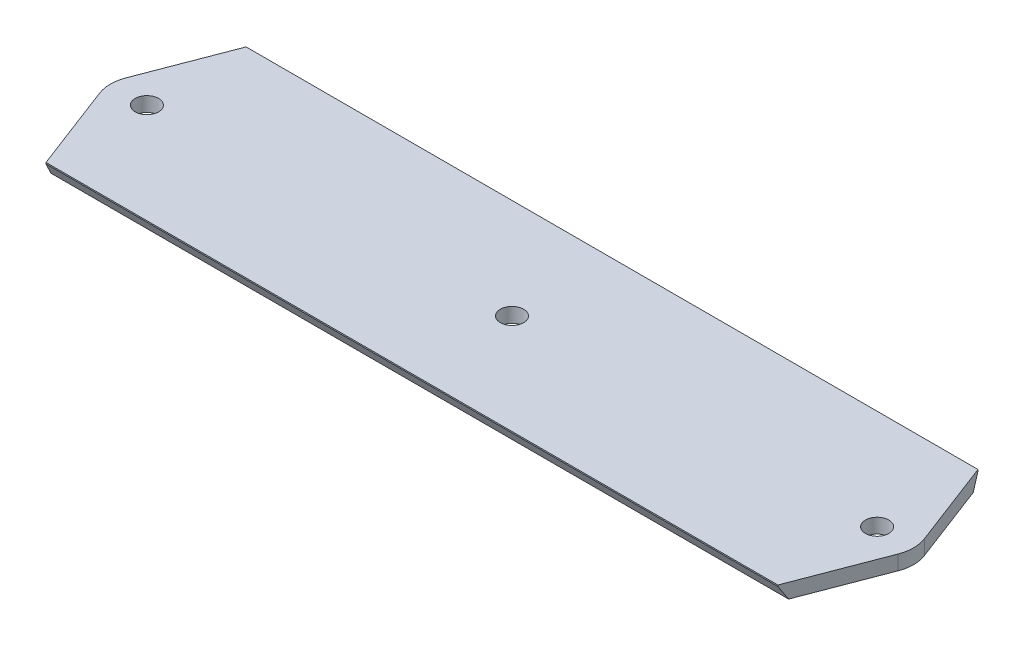
ISO-10303-21;
HEADER;
FILE_DESCRIPTION(('STEP AP214'),'2;1');
FILE_NAME('part.step','',(''),(''),'','','');
FILE_SCHEMA(('AUTOMOTIVE_DESIGN { 1 0 10303 214 1 1 1 1 }'));
ENDSEC;
DATA;
#1=APPLICATION_CONTEXT('core data for automotive mechanical design processes');
#2=APPLICATION_PROTOCOL_DEFINITION('international standard','automotive_design',2000,#1);
#3=PRODUCT_CONTEXT('',#1,'mechanical');
#4=PRODUCT('Part','Part','',(#3));
#5=PRODUCT_RELATED_PRODUCT_CATEGORY('part','',(#4));
#6=PRODUCT_DEFINITION_FORMATION('','',#4);
#7=PRODUCT_DEFINITION_CONTEXT('part definition',#1,'design');
#8=PRODUCT_DEFINITION('design','',#6,#7);
#9=PRODUCT_DEFINITION_SHAPE('','',#8);
#10=(LENGTH_UNIT() NAMED_UNIT(*) SI_UNIT(.MILLI.,.METRE.));
#11=(NAMED_UNIT(*) PLANE_ANGLE_UNIT() SI_UNIT($,.RADIAN.));
#12=(NAMED_UNIT(*) SI_UNIT($,.STERADIAN.) SOLID_ANGLE_UNIT());
#13=UNCERTAINTY_MEASURE_WITH_UNIT(LENGTH_MEASURE(1.E-05),#10,'distance_accuracy_value','');
#14=(GEOMETRIC_REPRESENTATION_CONTEXT(3) GLOBAL_UNCERTAINTY_ASSIGNED_CONTEXT((#13)) GLOBAL_UNIT_ASSIGNED_CONTEXT((#10,
#11,#12)) REPRESENTATION_CONTEXT('',''));
#15=CARTESIAN_POINT('',(0.,0.,0.));
#16=DIRECTION('',(0.,0.,1.));
#17=DIRECTION('',(1.,0.,0.));
#18=AXIS2_PLACEMENT_3D('',#15,#16,#17);
#19=CARTESIAN_POINT('',(-70.1039223374669,2.,-26.8049046504249));
#20=DIRECTION('',(0.934049773615858,0.,0.357142857142859));
#21=DIRECTION('',(0.357142857142859,0.,-0.934049773615858));
#22=AXIS2_PLACEMENT_3D('',#19,#20,#21);
#23=PLANE('',#22);
#24=DIRECTION('',(-0.357142857142859,0.,0.934049773615858));
#25=VECTOR('',#24,1.);
#26=CARTESIAN_POINT('',(-70.1039223374669,2.,-26.8049046504249));
#27=LINE('',#26,#25);
#28=CARTESIAN_POINT('',(-75.1147078669352,2.,-13.7));
#29=VERTEX_POINT('',#28);
#30=CARTESIAN_POINT('',(-79.6702488680793,2.,-1.78571428571428));
#31=VERTEX_POINT('',#30);
#32=EDGE_CURVE('E171',#29,#31,#27,.T.);
#33=ORIENTED_EDGE('',*,*,#32,.F.);
#34=DIRECTION('',(0.,1.,0.));
#35=VECTOR('',#34,1.);
#36=CARTESIAN_POINT('',(-75.1147078669352,1.99999999999989,-13.7));
#37=LINE('',#36,#35);
#38=CARTESIAN_POINT('',(-75.1147078669352,1.82679491924312,-13.7));
#39=VERTEX_POINT('',#38);
#40=EDGE_CURVE('E197',#29,#39,#37,.F.);
#41=ORIENTED_EDGE('',*,*,#40,.T.);
#42=DIRECTION('',(0.187778941547171,0.850619951466911,-0.491105657957485));
#43=VECTOR('',#42,1.);
#44=CARTESIAN_POINT('',(-73.7018319726874,8.22698236673688,-17.3951499456746));
#45=LINE('',#44,#43);
#46=CARTESIAN_POINT('',(-75.5179826969785,0.,-12.6452994616208));
#47=VERTEX_POINT('',#46);
#48=EDGE_CURVE('E243',#47,#39,#45,.T.);
#49=ORIENTED_EDGE('',*,*,#48,.F.);
#50=DIRECTION('',(-0.357142857142859,0.,0.934049773615858));
#51=VECTOR('',#50,1.);
#52=CARTESIAN_POINT('',(-70.1039223374669,0.,-26.8049046504249));
#53=LINE('',#52,#51);
#54=CARTESIAN_POINT('',(-79.6702488680793,0.,-1.78571428571428));
#55=VERTEX_POINT('',#54);
#56=EDGE_CURVE('E149',#47,#55,#53,.T.);
#57=ORIENTED_EDGE('',*,*,#56,.T.);
#58=DIRECTION('',(0.,-1.,0.));
#59=VECTOR('',#58,1.);
#60=CARTESIAN_POINT('',(-79.6702488680793,2.,-1.78571428571428));
#61=LINE('',#60,#59);
#62=EDGE_CURVE('E183',#31,#55,#61,.T.);
#63=ORIENTED_EDGE('',*,*,#62,.F.);
#64=EDGE_LOOP('',(#33,#41,#49,#57,#63));
#65=FACE_BOUND('',#64,.T.);
#66=ADVANCED_FACE('F41',(#65),#23,.F.);
#67=CARTESIAN_POINT('',(26.4814733578752,2.,-10.1254444072846));
#68=DIRECTION('',(0.934049773615857,0.,-0.357142857142862));
#69=DIRECTION('',(-0.357142857142862,0.,-0.934049773615857));
#70=AXIS2_PLACEMENT_3D('',#67,#68,#69);
#71=PLANE('',#70);
#72=DIRECTION('',(-0.187778941547172,0.85061995146691,-0.491105657957485));
#73=VECTOR('',#72,1.);
#74=CARTESIAN_POINT('',(25.4648785171162,0.240556659468798,-12.7841849137204));
#75=LINE('',#74,#73);
#76=CARTESIAN_POINT('',(25.5179826969785,0.,-12.6452994616208));
#77=VERTEX_POINT('',#76);
#78=CARTESIAN_POINT('',(25.1147078669353,1.82679491924312,-13.7));
#79=VERTEX_POINT('',#78);
#80=EDGE_CURVE('E127',#77,#79,#75,.T.);
#81=ORIENTED_EDGE('',*,*,#80,.T.);
#82=DIRECTION('',(0.,-1.,0.));
#83=VECTOR('',#82,1.);
#84=CARTESIAN_POINT('',(25.1147078669353,2.00000000000002,-13.7));
#85=LINE('',#84,#83);
#86=CARTESIAN_POINT('',(25.1147078669353,2.,-13.7));
#87=VERTEX_POINT('',#86);
#88=EDGE_CURVE('E203',#79,#87,#85,.F.);
#89=ORIENTED_EDGE('',*,*,#88,.T.);
#90=DIRECTION('',(0.357142857142862,0.,0.934049773615857));
#91=VECTOR('',#90,1.);
#92=CARTESIAN_POINT('',(26.4814733578752,2.,-10.1254444072846));
#93=LINE('',#92,#91);
#94=CARTESIAN_POINT('',(29.6702488680792,2.,-1.7857142857146));
#95=VERTEX_POINT('',#94);
#96=EDGE_CURVE('E221',#87,#95,#93,.T.);
#97=ORIENTED_EDGE('',*,*,#96,.T.);
#98=DIRECTION('',(0.,-1.,0.));
#99=VECTOR('',#98,1.);
#100=CARTESIAN_POINT('',(29.6702488680792,2.,-1.7857142857146));
#101=LINE('',#100,#99);
#102=CARTESIAN_POINT('',(29.6702488680792,0.,-1.7857142857146));
#103=VERTEX_POINT('',#102);
#104=EDGE_CURVE('E172',#95,#103,#101,.T.);
#105=ORIENTED_EDGE('',*,*,#104,.T.);
#106=DIRECTION('',(0.357142857142862,0.,0.934049773615857));
#107=VECTOR('',#106,1.);
#108=CARTESIAN_POINT('',(26.4814733578752,0.,-10.1254444072846));
#109=LINE('',#108,#107);
#110=EDGE_CURVE('E156',#77,#103,#109,.T.);
#111=ORIENTED_EDGE('',*,*,#110,.F.);
#112=EDGE_LOOP('',(#81,#89,#97,#105,#111));
#113=FACE_BOUND('',#112,.T.);
#114=ADVANCED_FACE('F258',(#113),#71,.T.);
#115=CARTESIAN_POINT('',(0.,2.,0.));
#116=DIRECTION('',(0.,1.,0.));
#117=DIRECTION('',(0.,0.,1.));
#118=AXIS2_PLACEMENT_3D('',#115,#116,#117);
#119=PLANE('',#118);
#120=DIRECTION('',(-0.357142857142859,0.,-0.934049773615858));
#121=VECTOR('',#120,1.);
#122=CARTESIAN_POINT('',(-70.1039223374669,2.,26.8049046504249));
#123=LINE('',#122,#121);
#124=CARTESIAN_POINT('',(-75.1147078669353,2.,13.7));
#125=VERTEX_POINT('',#124);
#126=CARTESIAN_POINT('',(-79.6702488680793,2.,1.78571428571427));
#127=VERTEX_POINT('',#126);
#128=EDGE_CURVE('E231',#125,#127,#123,.T.);
#129=ORIENTED_EDGE('',*,*,#128,.F.);
#130=DIRECTION('',(1.,0.,0.));
#131=VECTOR('',#130,1.);
#132=CARTESIAN_POINT('',(25.0764719112902,2.,13.7));
#133=LINE('',#132,#131);
#134=CARTESIAN_POINT('',(25.1147078669353,2.,13.7));
#135=VERTEX_POINT('',#134);
#136=EDGE_CURVE('E50',#125,#135,#133,.T.);
#137=ORIENTED_EDGE('',*,*,#136,.T.);
#138=DIRECTION('',(0.357142857142852,0.,-0.934049773615861));
#139=VECTOR('',#138,1.);
#140=CARTESIAN_POINT('',(26.4814733578752,2.,10.1254444072843));
#141=LINE('',#140,#139);
#142=CARTESIAN_POINT('',(29.6702488680793,2.,1.78571428571398));
#143=VERTEX_POINT('',#142);
#144=EDGE_CURVE('E228',#135,#143,#141,.T.);
#145=ORIENTED_EDGE('',*,*,#144,.T.);
#146=CARTESIAN_POINT('',(25.,2.,-2.1163626406917E-13));
#147=DIRECTION('',(0.,1.,0.));
#148=DIRECTION('',(0.,0.,1.));
#149=AXIS2_PLACEMENT_3D('',#146,#147,#148);
#150=CIRCLE('',#149,5.);
#151=EDGE_CURVE('E224',#143,#95,#150,.T.);
#152=ORIENTED_EDGE('',*,*,#151,.T.);
#153=ORIENTED_EDGE('',*,*,#96,.F.);
#154=DIRECTION('',(-1.,0.,0.));
#155=VECTOR('',#154,1.);
#156=CARTESIAN_POINT('',(0.,2.,-13.7));
#157=LINE('',#156,#155);
#158=EDGE_CURVE('E193',#87,#29,#157,.T.);
#159=ORIENTED_EDGE('',*,*,#158,.T.);
#160=ORIENTED_EDGE('',*,*,#32,.T.);
#161=CARTESIAN_POINT('',(-75.,2.,0.));
#162=DIRECTION('',(0.,1.,0.));
#163=DIRECTION('',(0.,0.,1.));
#164=AXIS2_PLACEMENT_3D('',#161,#162,#163);
#165=CIRCLE('',#164,4.99999999999998);
#166=EDGE_CURVE('E234',#31,#127,#165,.T.);
#167=ORIENTED_EDGE('',*,*,#166,.T.);
#168=EDGE_LOOP('',(#129,#137,#145,#152,#153,#159,#160,#167));
#169=FACE_BOUND('',#168,.T.);
#170=CARTESIAN_POINT('',(25.,2.,-2.1163626406917E-13));
#171=DIRECTION('',(0.,1.,0.));
#172=DIRECTION('',(0.,0.,1.));
#173=AXIS2_PLACEMENT_3D('',#170,#171,#172);
#174=CIRCLE('',#173,1.6);
#175=CARTESIAN_POINT('',(25.,2.,1.59999999999979));
#176=VERTEX_POINT('',#175);
#177=EDGE_CURVE('E217',#176,#176,#174,.T.);
#178=ORIENTED_EDGE('',*,*,#177,.F.);
#179=EDGE_LOOP('',(#178));
#180=FACE_BOUND('',#179,.T.);
#181=CARTESIAN_POINT('',(-25.,2.,-1.11022302462516E-13));
#182=DIRECTION('',(0.,1.,0.));
#183=DIRECTION('',(0.,0.,1.));
#184=AXIS2_PLACEMENT_3D('',#181,#182,#183);
#185=CIRCLE('',#184,1.6);
#186=CARTESIAN_POINT('',(-25.,2.,1.59999999999989));
#187=VERTEX_POINT('',#186);
#188=EDGE_CURVE('E213',#187,#187,#185,.T.);
#189=ORIENTED_EDGE('',*,*,#188,.F.);
#190=EDGE_LOOP('',(#189));
#191=FACE_BOUND('',#190,.T.);
#192=CARTESIAN_POINT('',(-75.,2.,0.));
#193=DIRECTION('',(0.,1.,0.));
#194=DIRECTION('',(0.,0.,1.));
#195=AXIS2_PLACEMENT_3D('',#192,#193,#194);
#196=CIRCLE('',#195,1.60000000000001);
#197=CARTESIAN_POINT('',(-75.,2.,1.6));
#198=VERTEX_POINT('',#197);
#199=EDGE_CURVE('E177',#198,#198,#196,.T.);
#200=ORIENTED_EDGE('',*,*,#199,.F.);
#201=EDGE_LOOP('',(#200));
#202=FACE_BOUND('',#201,.T.);
#203=ADVANCED_FACE('F264',(#169,#180,#191,#202),#119,.T.);
#204=CARTESIAN_POINT('',(0.,0.,0.));
#205=DIRECTION('',(0.,1.,0.));
#206=DIRECTION('',(0.,0.,1.));
#207=AXIS2_PLACEMENT_3D('',#204,#205,#206);
#208=PLANE('',#207);
#209=CARTESIAN_POINT('',(-75.,0.,0.));
#210=DIRECTION('',(0.,1.,0.));
#211=DIRECTION('',(0.,0.,1.));
#212=AXIS2_PLACEMENT_3D('',#209,#210,#211);
#213=CIRCLE('',#212,1.60000000000001);
#214=CARTESIAN_POINT('',(-75.,0.,1.6));
#215=VERTEX_POINT('',#214);
#216=EDGE_CURVE('E167',#215,#215,#213,.T.);
#217=ORIENTED_EDGE('',*,*,#216,.T.);
#218=EDGE_LOOP('',(#217));
#219=FACE_BOUND('',#218,.T.);
#220=CARTESIAN_POINT('',(-25.,0.,-1.11022302462516E-13));
#221=DIRECTION('',(0.,1.,0.));
#222=DIRECTION('',(0.,0.,1.));
#223=AXIS2_PLACEMENT_3D('',#220,#221,#222);
#224=CIRCLE('',#223,1.6);
#225=CARTESIAN_POINT('',(-25.,0.,1.59999999999989));
#226=VERTEX_POINT('',#225);
#227=EDGE_CURVE('E163',#226,#226,#224,.T.);
#228=ORIENTED_EDGE('',*,*,#227,.T.);
#229=EDGE_LOOP('',(#228));
#230=FACE_BOUND('',#229,.T.);
#231=CARTESIAN_POINT('',(25.,0.,-2.1163626406917E-13));
#232=DIRECTION('',(0.,1.,0.));
#233=DIRECTION('',(0.,0.,1.));
#234=AXIS2_PLACEMENT_3D('',#231,#232,#233);
#235=CIRCLE('',#234,1.6);
#236=CARTESIAN_POINT('',(25.,0.,1.59999999999979));
#237=VERTEX_POINT('',#236);
#238=EDGE_CURVE('E159',#237,#237,#235,.T.);
#239=ORIENTED_EDGE('',*,*,#238,.T.);
#240=EDGE_LOOP('',(#239));
#241=FACE_BOUND('',#240,.T.);
#242=DIRECTION('',(0.357142857142852,0.,-0.934049773615861));
#243=VECTOR('',#242,1.);
#244=CARTESIAN_POINT('',(26.4814733578752,0.,10.1254444072843));
#245=LINE('',#244,#243);
#246=CARTESIAN_POINT('',(25.5179826969785,0.,12.6452994616207));
#247=VERTEX_POINT('',#246);
#248=CARTESIAN_POINT('',(29.6702488680793,0.,1.78571428571398));
#249=VERTEX_POINT('',#248);
#250=EDGE_CURVE('E135',#247,#249,#245,.T.);
#251=ORIENTED_EDGE('',*,*,#250,.F.);
#252=DIRECTION('',(-1.,0.,0.));
#253=VECTOR('',#252,1.);
#254=CARTESIAN_POINT('',(30.,0.,12.6452994616207));
#255=LINE('',#254,#253);
#256=CARTESIAN_POINT('',(-75.5179826969785,0.,12.6452994616208));
#257=VERTEX_POINT('',#256);
#258=EDGE_CURVE('E121',#247,#257,#255,.T.);
#259=ORIENTED_EDGE('',*,*,#258,.T.);
#260=DIRECTION('',(-0.357142857142859,0.,-0.934049773615858));
#261=VECTOR('',#260,1.);
#262=CARTESIAN_POINT('',(-70.1039223374669,0.,26.8049046504249));
#263=LINE('',#262,#261);
#264=CARTESIAN_POINT('',(-79.6702488680793,0.,1.78571428571427));
#265=VERTEX_POINT('',#264);
#266=EDGE_CURVE('E132',#257,#265,#263,.T.);
#267=ORIENTED_EDGE('',*,*,#266,.T.);
#268=CARTESIAN_POINT('',(-75.,0.,0.));
#269=DIRECTION('',(0.,1.,0.));
#270=DIRECTION('',(0.,0.,1.));
#271=AXIS2_PLACEMENT_3D('',#268,#269,#270);
#272=CIRCLE('',#271,4.99999999999998);
#273=EDGE_CURVE('E143',#55,#265,#272,.T.);
#274=ORIENTED_EDGE('',*,*,#273,.F.);
#275=ORIENTED_EDGE('',*,*,#56,.F.);
#276=DIRECTION('',(-1.,0.,0.));
#277=VECTOR('',#276,1.);
#278=CARTESIAN_POINT('',(0.,0.,-12.6452994616208));
#279=LINE('',#278,#277);
#280=EDGE_CURVE('E187',#77,#47,#279,.T.);
#281=ORIENTED_EDGE('',*,*,#280,.F.);
#282=ORIENTED_EDGE('',*,*,#110,.T.);
#283=CARTESIAN_POINT('',(25.,0.,-2.1163626406917E-13));
#284=DIRECTION('',(0.,1.,0.));
#285=DIRECTION('',(0.,0.,1.));
#286=AXIS2_PLACEMENT_3D('',#283,#284,#285);
#287=CIRCLE('',#286,5.);
#288=EDGE_CURVE('E147',#249,#103,#287,.T.);
#289=ORIENTED_EDGE('',*,*,#288,.F.);
#290=EDGE_LOOP('',(#251,#259,#267,#274,#275,#281,#282,#289));
#291=FACE_BOUND('',#290,.T.);
#292=ADVANCED_FACE('F130',(#219,#230,#241,#291),#208,.F.);
#293=CARTESIAN_POINT('',(-75.,2.,0.));
#294=DIRECTION('',(0.,-1.,0.));
#295=DIRECTION('',(0.,0.,-1.));
#296=AXIS2_PLACEMENT_3D('',#293,#294,#295);
#297=CYLINDRICAL_SURFACE('',#296,4.99999999999998);
#298=ORIENTED_EDGE('',*,*,#273,.T.);
#299=DIRECTION('',(0.,-1.,0.));
#300=VECTOR('',#299,1.);
#301=CARTESIAN_POINT('',(-79.6702488680793,2.,1.78571428571427));
#302=LINE('',#301,#300);
#303=EDGE_CURVE('E140',#127,#265,#302,.T.);
#304=ORIENTED_EDGE('',*,*,#303,.F.);
#305=ORIENTED_EDGE('',*,*,#166,.F.);
#306=ORIENTED_EDGE('',*,*,#62,.T.);
#307=EDGE_LOOP('',(#298,#304,#305,#306));
#308=FACE_BOUND('',#307,.T.);
#309=ADVANCED_FACE('F268',(#308),#297,.T.);
#310=CARTESIAN_POINT('',(-70.1039223374669,2.,26.8049046504249));
#311=DIRECTION('',(-0.934049773615858,0.,0.357142857142859));
#312=DIRECTION('',(0.357142857142859,0.,0.934049773615858));
#313=AXIS2_PLACEMENT_3D('',#310,#311,#312);
#314=PLANE('',#313);
#315=DIRECTION('',(-0.18777894154717,-0.850619951466911,-0.491105657957485));
#316=VECTOR('',#315,1.);
#317=CARTESIAN_POINT('',(-73.7018319726874,8.22698236673688,17.3951499456746));
#318=LINE('',#317,#316);
#319=CARTESIAN_POINT('',(-75.1147078669353,1.82679491924309,13.7));
#320=VERTEX_POINT('',#319);
#321=EDGE_CURVE('E117',#320,#257,#318,.T.);
#322=ORIENTED_EDGE('',*,*,#321,.F.);
#323=DIRECTION('',(0.,1.,0.));
#324=VECTOR('',#323,1.);
#325=CARTESIAN_POINT('',(-75.1147078669353,2.00000000000006,13.7));
#326=LINE('',#325,#324);
#327=EDGE_CURVE('E64',#320,#125,#326,.T.);
#328=ORIENTED_EDGE('',*,*,#327,.T.);
#329=ORIENTED_EDGE('',*,*,#128,.T.);
#330=ORIENTED_EDGE('',*,*,#303,.T.);
#331=ORIENTED_EDGE('',*,*,#266,.F.);
#332=EDGE_LOOP('',(#322,#328,#329,#330,#331));
#333=FACE_BOUND('',#332,.T.);
#334=ADVANCED_FACE('F138',(#333),#314,.T.);
#335=CARTESIAN_POINT('',(26.4814733578752,2.,10.1254444072843));
#336=DIRECTION('',(-0.934049773615861,0.,-0.357142857142852));
#337=DIRECTION('',(-0.357142857142852,0.,0.934049773615861));
#338=AXIS2_PLACEMENT_3D('',#335,#336,#337);
#339=PLANE('',#338);
#340=ORIENTED_EDGE('',*,*,#144,.F.);
#341=DIRECTION('',(0.,-1.,0.));
#342=VECTOR('',#341,1.);
#343=CARTESIAN_POINT('',(25.1147078669353,1.82679491924308,13.7));
#344=LINE('',#343,#342);
#345=CARTESIAN_POINT('',(25.1147078669353,1.82679491924309,13.7));
#346=VERTEX_POINT('',#345);
#347=EDGE_CURVE('E11',#135,#346,#344,.T.);
#348=ORIENTED_EDGE('',*,*,#347,.T.);
#349=DIRECTION('',(0.187778941547166,-0.850619951466912,-0.491105657957485));
#350=VECTOR('',#349,1.);
#351=CARTESIAN_POINT('',(25.4648785171162,0.240556659468682,12.7841849137203));
#352=LINE('',#351,#350);
#353=EDGE_CURVE('E190',#346,#247,#352,.T.);
#354=ORIENTED_EDGE('',*,*,#353,.T.);
#355=ORIENTED_EDGE('',*,*,#250,.T.);
#356=DIRECTION('',(0.,-1.,0.));
#357=VECTOR('',#356,1.);
#358=CARTESIAN_POINT('',(29.6702488680793,2.,1.78571428571398));
#359=LINE('',#358,#357);
#360=EDGE_CURVE('E176',#143,#249,#359,.T.);
#361=ORIENTED_EDGE('',*,*,#360,.F.);
#362=EDGE_LOOP('',(#340,#348,#354,#355,#361));
#363=FACE_BOUND('',#362,.T.);
#364=ADVANCED_FACE('F272',(#363),#339,.F.);
#365=CARTESIAN_POINT('',(25.,2.,-2.1163626406917E-13));
#366=DIRECTION('',(0.,-1.,0.));
#367=DIRECTION('',(0.,0.,-1.));
#368=AXIS2_PLACEMENT_3D('',#365,#366,#367);
#369=CYLINDRICAL_SURFACE('',#368,5.);
#370=ORIENTED_EDGE('',*,*,#288,.T.);
#371=ORIENTED_EDGE('',*,*,#104,.F.);
#372=ORIENTED_EDGE('',*,*,#151,.F.);
#373=ORIENTED_EDGE('',*,*,#360,.T.);
#374=EDGE_LOOP('',(#370,#371,#372,#373));
#375=FACE_BOUND('',#374,.T.);
#376=ADVANCED_FACE('F277',(#375),#369,.T.);
#377=CARTESIAN_POINT('',(-25.,2.,-1.11022302462516E-13));
#378=DIRECTION('',(0.,-1.,0.));
#379=DIRECTION('',(0.,0.,-1.));
#380=AXIS2_PLACEMENT_3D('',#377,#378,#379);
#381=CYLINDRICAL_SURFACE('',#380,1.6);
#382=ORIENTED_EDGE('',*,*,#188,.T.);
#383=EDGE_LOOP('',(#382));
#384=FACE_BOUND('',#383,.T.);
#385=ORIENTED_EDGE('',*,*,#227,.F.);
#386=EDGE_LOOP('',(#385));
#387=FACE_BOUND('',#386,.T.);
#388=ADVANCED_FACE('F381',(#384,#387),#381,.F.);
#389=CARTESIAN_POINT('',(25.,2.,-2.1163626406917E-13));
#390=DIRECTION('',(0.,-1.,0.));
#391=DIRECTION('',(0.,0.,-1.));
#392=AXIS2_PLACEMENT_3D('',#389,#390,#391);
#393=CYLINDRICAL_SURFACE('',#392,1.6);
#394=ORIENTED_EDGE('',*,*,#177,.T.);
#395=EDGE_LOOP('',(#394));
#396=FACE_BOUND('',#395,.T.);
#397=ORIENTED_EDGE('',*,*,#238,.F.);
#398=EDGE_LOOP('',(#397));
#399=FACE_BOUND('',#398,.T.);
#400=ADVANCED_FACE('F287',(#396,#399),#393,.F.);
#401=CARTESIAN_POINT('',(-75.,2.,0.));
#402=DIRECTION('',(0.,-1.,0.));
#403=DIRECTION('',(0.,0.,-1.));
#404=AXIS2_PLACEMENT_3D('',#401,#402,#403);
#405=CYLINDRICAL_SURFACE('',#404,1.60000000000001);
#406=ORIENTED_EDGE('',*,*,#199,.T.);
#407=EDGE_LOOP('',(#406));
#408=FACE_BOUND('',#407,.T.);
#409=ORIENTED_EDGE('',*,*,#216,.F.);
#410=EDGE_LOOP('',(#409));
#411=FACE_BOUND('',#410,.T.);
#412=ADVANCED_FACE('F280',(#408,#411),#405,.F.);
#413=CARTESIAN_POINT('',(30.,-5.47557528611262,-9.4839745962156));
#414=DIRECTION('',(0.,-0.499999999999999,-0.86602540378444));
#415=DIRECTION('',(0.,0.86602540378444,-0.499999999999999));
#416=AXIS2_PLACEMENT_3D('',#413,#414,#415);
#417=PLANE('',#416);
#418=ORIENTED_EDGE('',*,*,#48,.T.);
#419=DIRECTION('',(1.,0.,0.));
#420=VECTOR('',#419,1.);
#421=CARTESIAN_POINT('',(30.,1.82679491924312,-13.7));
#422=LINE('',#421,#420);
#423=EDGE_CURVE('E200',#39,#79,#422,.T.);
#424=ORIENTED_EDGE('',*,*,#423,.T.);
#425=ORIENTED_EDGE('',*,*,#80,.F.);
#426=ORIENTED_EDGE('',*,*,#280,.T.);
#427=EDGE_LOOP('',(#418,#424,#425,#426));
#428=FACE_BOUND('',#427,.T.);
#429=ADVANCED_FACE('F278',(#428),#417,.T.);
#430=CARTESIAN_POINT('',(30.,-5.47557528611261,9.48397459621558));
#431=DIRECTION('',(0.,0.499999999999998,-0.86602540378444));
#432=DIRECTION('',(0.,0.86602540378444,0.499999999999998));
#433=AXIS2_PLACEMENT_3D('',#430,#431,#432);
#434=PLANE('',#433);
#435=ORIENTED_EDGE('',*,*,#353,.F.);
#436=DIRECTION('',(-1.,0.,0.));
#437=VECTOR('',#436,1.);
#438=CARTESIAN_POINT('',(-75.0764719112902,1.82679491924309,13.7));
#439=LINE('',#438,#437);
#440=EDGE_CURVE('E124',#346,#320,#439,.T.);
#441=ORIENTED_EDGE('',*,*,#440,.T.);
#442=ORIENTED_EDGE('',*,*,#321,.T.);
#443=ORIENTED_EDGE('',*,*,#258,.F.);
#444=EDGE_LOOP('',(#435,#441,#442,#443));
#445=FACE_BOUND('',#444,.T.);
#446=ADVANCED_FACE('F120',(#445),#434,.F.);
#447=CARTESIAN_POINT('',(0.,2.,-13.7));
#448=DIRECTION('',(0.,0.,1.));
#449=DIRECTION('',(-1.,0.,0.));
#450=AXIS2_PLACEMENT_3D('',#447,#448,#449);
#451=PLANE('',#450);
#452=ORIENTED_EDGE('',*,*,#88,.F.);
#453=ORIENTED_EDGE('',*,*,#423,.F.);
#454=ORIENTED_EDGE('',*,*,#40,.F.);
#455=ORIENTED_EDGE('',*,*,#158,.F.);
#456=EDGE_LOOP('',(#452,#453,#454,#455));
#457=FACE_BOUND('',#456,.T.);
#458=ADVANCED_FACE('F263',(#457),#451,.F.);
#459=CARTESIAN_POINT('',(30.,1.82679491924309,13.7));
#460=DIRECTION('',(0.,0.,1.));
#461=DIRECTION('',(1.,0.,0.));
#462=AXIS2_PLACEMENT_3D('',#459,#460,#461);
#463=PLANE('',#462);
#464=ORIENTED_EDGE('',*,*,#347,.F.);
#465=ORIENTED_EDGE('',*,*,#136,.F.);
#466=ORIENTED_EDGE('',*,*,#327,.F.);
#467=ORIENTED_EDGE('',*,*,#440,.F.);
#468=EDGE_LOOP('',(#464,#465,#466,#467));
#469=FACE_BOUND('',#468,.T.);
#470=ADVANCED_FACE('F43',(#469),#463,.T.);
#471=CLOSED_SHELL('',(#66,#114,#203,#292,#309,#334,#364,#376,#388,#400,#412,#429,#446,#458,#470));
#472=MANIFOLD_SOLID_BREP('B2',#471);
#473=ADVANCED_BREP_SHAPE_REPRESENTATION('',(#18,#472),#14);
#474=SHAPE_DEFINITION_REPRESENTATION(#9,#473);
ENDSEC;
END-ISO-10303-21;
